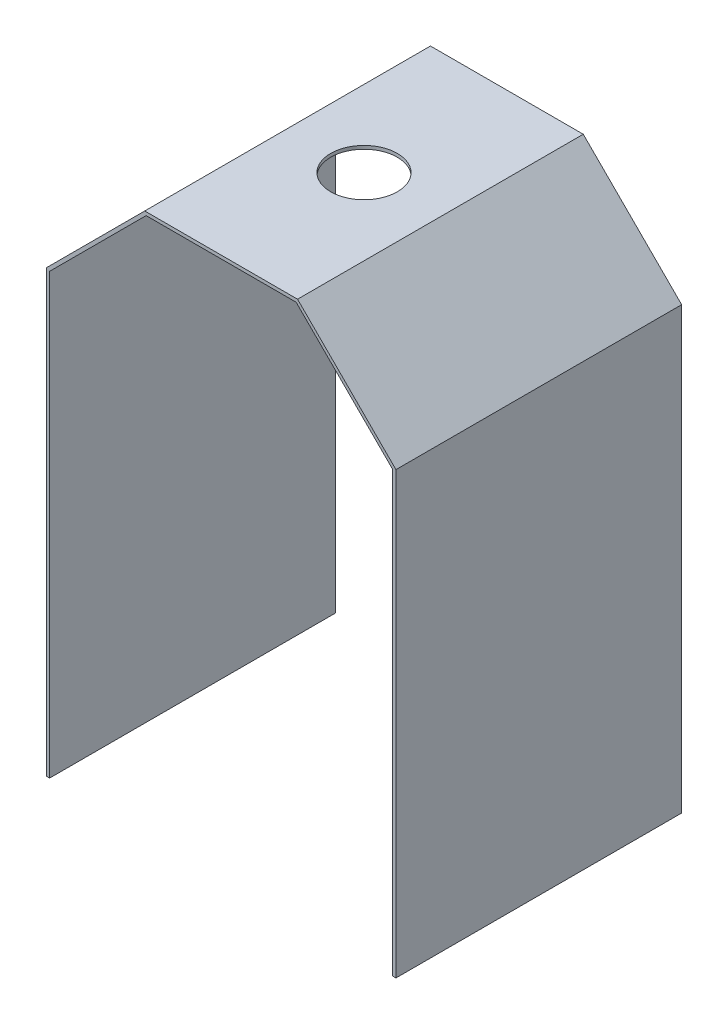
ISO-10303-21;
HEADER;
FILE_DESCRIPTION(('STEP AP214'),'2;1');
FILE_NAME('part.step','',(''),(''),'','','');
FILE_SCHEMA(('AUTOMOTIVE_DESIGN { 1 0 10303 214 1 1 1 1 }'));
ENDSEC;
DATA;
#1=APPLICATION_CONTEXT('core data for automotive mechanical design processes');
#2=APPLICATION_PROTOCOL_DEFINITION('international standard','automotive_design',2000,#1);
#3=PRODUCT_CONTEXT('',#1,'mechanical');
#4=PRODUCT('Part','Part','',(#3));
#5=PRODUCT_RELATED_PRODUCT_CATEGORY('part','',(#4));
#6=PRODUCT_DEFINITION_FORMATION('','',#4);
#7=PRODUCT_DEFINITION_CONTEXT('part definition',#1,'design');
#8=PRODUCT_DEFINITION('design','',#6,#7);
#9=PRODUCT_DEFINITION_SHAPE('','',#8);
#10=(LENGTH_UNIT() NAMED_UNIT(*) SI_UNIT(.MILLI.,.METRE.));
#11=(NAMED_UNIT(*) PLANE_ANGLE_UNIT() SI_UNIT($,.RADIAN.));
#12=(NAMED_UNIT(*) SI_UNIT($,.STERADIAN.) SOLID_ANGLE_UNIT());
#13=UNCERTAINTY_MEASURE_WITH_UNIT(LENGTH_MEASURE(1.E-05),#10,'distance_accuracy_value','');
#14=(GEOMETRIC_REPRESENTATION_CONTEXT(3) GLOBAL_UNCERTAINTY_ASSIGNED_CONTEXT((#13)) GLOBAL_UNIT_ASSIGNED_CONTEXT((#10,
#11,#12)) REPRESENTATION_CONTEXT('',''));
#15=CARTESIAN_POINT('',(0.,0.,0.));
#16=DIRECTION('',(0.,0.,1.));
#17=DIRECTION('',(1.,0.,0.));
#18=AXIS2_PLACEMENT_3D('',#15,#16,#17);
#19=CARTESIAN_POINT('',(111.274765367419,579.392618769199,171.62));
#20=DIRECTION('',(1.,-1.47352495958527E-08,0.));
#21=DIRECTION('',(1.47352495958527E-08,1.,0.));
#22=AXIS2_PLACEMENT_3D('',#19,#20,#21);
#23=PLANE('',#22);
#24=DIRECTION('',(-1.47352495958527E-08,-1.,0.));
#25=VECTOR('',#24,1.);
#26=CARTESIAN_POINT('',(111.274765367419,579.392618769199,0.));
#27=LINE('',#26,#25);
#28=CARTESIAN_POINT('',(111.274765355212,578.56419162719,0.));
#29=VERTEX_POINT('',#28);
#30=CARTESIAN_POINT('',(111.274761470444,314.926454701874,0.));
#31=VERTEX_POINT('',#30);
#32=EDGE_CURVE('E153',#29,#31,#27,.T.);
#33=ORIENTED_EDGE('',*,*,#32,.T.);
#34=DIRECTION('',(0.,0.,-1.));
#35=VECTOR('',#34,1.);
#36=CARTESIAN_POINT('',(111.274761470444,314.926454701874,171.62));
#37=LINE('',#36,#35);
#38=CARTESIAN_POINT('',(111.274761470444,314.926454701874,171.62));
#39=VERTEX_POINT('',#38);
#40=EDGE_CURVE('E11',#39,#31,#37,.T.);
#41=ORIENTED_EDGE('',*,*,#40,.F.);
#42=DIRECTION('',(-1.47352495958527E-08,-1.,0.));
#43=VECTOR('',#42,1.);
#44=CARTESIAN_POINT('',(111.274765367419,579.392618769199,171.62));
#45=LINE('',#44,#43);
#46=CARTESIAN_POINT('',(111.274765355212,578.56419162719,171.62));
#47=VERTEX_POINT('',#46);
#48=EDGE_CURVE('E101',#47,#39,#45,.T.);
#49=ORIENTED_EDGE('',*,*,#48,.F.);
#50=DIRECTION('',(0.,0.,-1.));
#51=VECTOR('',#50,1.);
#52=CARTESIAN_POINT('',(111.274765355212,578.56419162719,171.62));
#53=LINE('',#52,#51);
#54=EDGE_CURVE('E149',#47,#29,#53,.T.);
#55=ORIENTED_EDGE('',*,*,#54,.T.);
#56=EDGE_LOOP('',(#33,#41,#49,#55));
#57=FACE_BOUND('',#56,.T.);
#58=ADVANCED_FACE('F32',(#57),#23,.F.);
#59=CARTESIAN_POINT('',(113.274761470444,314.926454672404,171.62));
#60=DIRECTION('',(-1.47352408053081E-08,-1.,0.));
#61=DIRECTION('',(1.,-1.47352408053081E-08,0.));
#62=AXIS2_PLACEMENT_3D('',#59,#60,#61);
#63=PLANE('',#62);
#64=DIRECTION('',(-1.,1.47352408053081E-08,0.));
#65=VECTOR('',#64,1.);
#66=CARTESIAN_POINT('',(113.274761470444,314.926454672404,0.));
#67=LINE('',#66,#65);
#68=CARTESIAN_POINT('',(113.274761470444,314.926454672404,0.));
#69=VERTEX_POINT('',#68);
#70=EDGE_CURVE('E156',#69,#31,#67,.T.);
#71=ORIENTED_EDGE('',*,*,#70,.F.);
#72=DIRECTION('',(0.,0.,-1.));
#73=VECTOR('',#72,1.);
#74=CARTESIAN_POINT('',(113.274761470444,314.926454672404,171.62));
#75=LINE('',#74,#73);
#76=CARTESIAN_POINT('',(113.274761470444,314.926454672404,171.62));
#77=VERTEX_POINT('',#76);
#78=EDGE_CURVE('E41',#77,#69,#75,.T.);
#79=ORIENTED_EDGE('',*,*,#78,.F.);
#80=DIRECTION('',(-1.,1.47352408053081E-08,0.));
#81=VECTOR('',#80,1.);
#82=CARTESIAN_POINT('',(113.274761470444,314.926454672404,171.62));
#83=LINE('',#82,#81);
#84=EDGE_CURVE('E219',#77,#39,#83,.T.);
#85=ORIENTED_EDGE('',*,*,#84,.T.);
#86=ORIENTED_EDGE('',*,*,#40,.T.);
#87=EDGE_LOOP('',(#71,#79,#85,#86));
#88=FACE_BOUND('',#87,.T.);
#89=ADVANCED_FACE('F206',(#88),#63,.T.);
#90=CARTESIAN_POINT('',(113.274765367419,579.392618739729,171.62));
#91=DIRECTION('',(1.,-1.47352495958527E-08,0.));
#92=DIRECTION('',(1.47352495958527E-08,1.,0.));
#93=AXIS2_PLACEMENT_3D('',#90,#91,#92);
#94=PLANE('',#93);
#95=DIRECTION('',(-1.47352495958527E-08,-1.,0.));
#96=VECTOR('',#95,1.);
#97=CARTESIAN_POINT('',(113.274765367419,579.392618739729,0.));
#98=LINE('',#97,#96);
#99=CARTESIAN_POINT('',(113.274765367419,579.392618739729,0.));
#100=VERTEX_POINT('',#99);
#101=EDGE_CURVE('E159',#100,#69,#98,.T.);
#102=ORIENTED_EDGE('',*,*,#101,.F.);
#103=DIRECTION('',(0.,0.,-1.));
#104=VECTOR('',#103,1.);
#105=CARTESIAN_POINT('',(113.274765367419,579.392618739729,171.62));
#106=LINE('',#105,#104);
#107=CARTESIAN_POINT('',(113.274765367419,579.392618739729,171.62));
#108=VERTEX_POINT('',#107);
#109=EDGE_CURVE('E195',#108,#100,#106,.T.);
#110=ORIENTED_EDGE('',*,*,#109,.F.);
#111=DIRECTION('',(-1.47352495958527E-08,-1.,0.));
#112=VECTOR('',#111,1.);
#113=CARTESIAN_POINT('',(113.274765367419,579.392618739729,171.62));
#114=LINE('',#113,#112);
#115=EDGE_CURVE('E203',#108,#77,#114,.T.);
#116=ORIENTED_EDGE('',*,*,#115,.T.);
#117=ORIENTED_EDGE('',*,*,#78,.T.);
#118=EDGE_LOOP('',(#102,#110,#116,#117));
#119=FACE_BOUND('',#118,.T.);
#120=ADVANCED_FACE('F201',(#119),#94,.T.);
#121=CARTESIAN_POINT('',(54.1708868349344,638.496497272214,171.62));
#122=DIRECTION('',(0.707106781186548,0.707106781186547,0.));
#123=DIRECTION('',(-0.707106781186547,0.707106781186548,0.));
#124=AXIS2_PLACEMENT_3D('',#121,#122,#123);
#125=PLANE('',#124);
#126=DIRECTION('',(0.707106781186547,-0.707106781186548,0.));
#127=VECTOR('',#126,1.);
#128=CARTESIAN_POINT('',(54.1708868349344,638.496497272214,0.));
#129=LINE('',#128,#127);
#130=CARTESIAN_POINT('',(54.1708868349344,638.496497272214,0.));
#131=VERTEX_POINT('',#130);
#132=EDGE_CURVE('E162',#131,#100,#129,.T.);
#133=ORIENTED_EDGE('',*,*,#132,.F.);
#134=DIRECTION('',(0.,0.,-1.));
#135=VECTOR('',#134,1.);
#136=CARTESIAN_POINT('',(54.1708868349344,638.496497272214,171.62));
#137=LINE('',#136,#135);
#138=CARTESIAN_POINT('',(54.1708868349344,638.496497272214,171.62));
#139=VERTEX_POINT('',#138);
#140=EDGE_CURVE('E193',#139,#131,#137,.T.);
#141=ORIENTED_EDGE('',*,*,#140,.F.);
#142=DIRECTION('',(0.707106781186547,-0.707106781186548,0.));
#143=VECTOR('',#142,1.);
#144=CARTESIAN_POINT('',(54.1708868349344,638.496497272214,171.62));
#145=LINE('',#144,#143);
#146=EDGE_CURVE('E216',#139,#108,#145,.T.);
#147=ORIENTED_EDGE('',*,*,#146,.T.);
#148=ORIENTED_EDGE('',*,*,#109,.T.);
#149=EDGE_LOOP('',(#133,#141,#147,#148));
#150=FACE_BOUND('',#149,.T.);
#151=ADVANCED_FACE('F213',(#150),#125,.T.);
#152=CARTESIAN_POINT('',(-37.621355544862,638.496497272214,171.62));
#153=DIRECTION('',(0.,1.,0.));
#154=DIRECTION('',(0.,0.,1.));
#155=AXIS2_PLACEMENT_3D('',#152,#153,#154);
#156=PLANE('',#155);
#157=CARTESIAN_POINT('',(8.27476564503624,638.496497272214,85.81));
#158=DIRECTION('',(0.,1.,0.));
#159=DIRECTION('',(0.,0.,1.));
#160=AXIS2_PLACEMENT_3D('',#157,#158,#159);
#161=CIRCLE('',#160,20.);
#162=CARTESIAN_POINT('',(8.27476564503624,638.496497272214,105.81));
#163=VERTEX_POINT('',#162);
#164=EDGE_CURVE('E281',#163,#163,#161,.T.);
#165=ORIENTED_EDGE('',*,*,#164,.F.);
#166=EDGE_LOOP('',(#165));
#167=FACE_BOUND('',#166,.T.);
#168=DIRECTION('',(1.,0.,0.));
#169=VECTOR('',#168,1.);
#170=CARTESIAN_POINT('',(-37.621355544862,638.496497272214,0.));
#171=LINE('',#170,#169);
#172=CARTESIAN_POINT('',(-37.621355544862,638.496497272214,0.));
#173=VERTEX_POINT('',#172);
#174=EDGE_CURVE('E165',#173,#131,#171,.T.);
#175=ORIENTED_EDGE('',*,*,#174,.F.);
#176=DIRECTION('',(0.,0.,-1.));
#177=VECTOR('',#176,1.);
#178=CARTESIAN_POINT('',(-37.621355544862,638.496497272214,171.62));
#179=LINE('',#178,#177);
#180=CARTESIAN_POINT('',(-37.621355544862,638.496497272214,171.62));
#181=VERTEX_POINT('',#180);
#182=EDGE_CURVE('E191',#181,#173,#179,.T.);
#183=ORIENTED_EDGE('',*,*,#182,.F.);
#184=DIRECTION('',(1.,0.,0.));
#185=VECTOR('',#184,1.);
#186=CARTESIAN_POINT('',(-37.621355544862,638.496497272214,171.62));
#187=LINE('',#186,#185);
#188=EDGE_CURVE('E221',#181,#139,#187,.T.);
#189=ORIENTED_EDGE('',*,*,#188,.T.);
#190=ORIENTED_EDGE('',*,*,#140,.T.);
#191=EDGE_LOOP('',(#175,#183,#189,#190));
#192=FACE_BOUND('',#191,.T.);
#193=ADVANCED_FACE('F286',(#167,#192),#156,.T.);
#194=CARTESIAN_POINT('',(-96.7252349101976,579.392619017346,171.62));
#195=DIRECTION('',(-0.707106774543843,0.707106787829252,0.));
#196=DIRECTION('',(-0.707106787829252,-0.707106774543843,0.));
#197=AXIS2_PLACEMENT_3D('',#194,#195,#196);
#198=PLANE('',#197);
#199=DIRECTION('',(0.707106787829252,0.707106774543843,0.));
#200=VECTOR('',#199,1.);
#201=CARTESIAN_POINT('',(-96.7252349101976,579.392619017346,0.));
#202=LINE('',#201,#200);
#203=CARTESIAN_POINT('',(-96.7252349101976,579.392619017346,0.));
#204=VERTEX_POINT('',#203);
#205=EDGE_CURVE('E168',#204,#173,#202,.T.);
#206=ORIENTED_EDGE('',*,*,#205,.F.);
#207=DIRECTION('',(0.,0.,-1.));
#208=VECTOR('',#207,1.);
#209=CARTESIAN_POINT('',(-96.7252349101976,579.392619017346,171.62));
#210=LINE('',#209,#208);
#211=CARTESIAN_POINT('',(-96.7252349101976,579.392619017346,171.62));
#212=VERTEX_POINT('',#211);
#213=EDGE_CURVE('E189',#212,#204,#210,.T.);
#214=ORIENTED_EDGE('',*,*,#213,.F.);
#215=DIRECTION('',(0.707106787829252,0.707106774543843,0.));
#216=VECTOR('',#215,1.);
#217=CARTESIAN_POINT('',(-96.7252349101976,579.392619017346,171.62));
#218=LINE('',#217,#216);
#219=EDGE_CURVE('E227',#212,#181,#218,.T.);
#220=ORIENTED_EDGE('',*,*,#219,.T.);
#221=ORIENTED_EDGE('',*,*,#182,.T.);
#222=EDGE_LOOP('',(#206,#214,#220,#221));
#223=FACE_BOUND('',#222,.T.);
#224=ADVANCED_FACE('F289',(#223),#198,.T.);
#225=CARTESIAN_POINT('',(-96.7252349101976,314.926453532472,171.62));
#226=DIRECTION('',(-1.,0.,0.));
#227=DIRECTION('',(0.,0.,1.));
#228=AXIS2_PLACEMENT_3D('',#225,#226,#227);
#229=PLANE('',#228);
#230=DIRECTION('',(0.,1.,0.));
#231=VECTOR('',#230,1.);
#232=CARTESIAN_POINT('',(-96.7252349101976,314.926453532472,0.));
#233=LINE('',#232,#231);
#234=CARTESIAN_POINT('',(-96.7252349101976,314.926453532472,0.));
#235=VERTEX_POINT('',#234);
#236=EDGE_CURVE('E171',#235,#204,#233,.T.);
#237=ORIENTED_EDGE('',*,*,#236,.F.);
#238=DIRECTION('',(0.,0.,-1.));
#239=VECTOR('',#238,1.);
#240=CARTESIAN_POINT('',(-96.7252349101976,314.926453532472,171.62));
#241=LINE('',#240,#239);
#242=CARTESIAN_POINT('',(-96.7252349101976,314.926453532472,171.62));
#243=VERTEX_POINT('',#242);
#244=EDGE_CURVE('E187',#243,#235,#241,.T.);
#245=ORIENTED_EDGE('',*,*,#244,.F.);
#246=DIRECTION('',(0.,1.,0.));
#247=VECTOR('',#246,1.);
#248=CARTESIAN_POINT('',(-96.7252349101976,314.926453532472,171.62));
#249=LINE('',#248,#247);
#250=EDGE_CURVE('E230',#243,#212,#249,.T.);
#251=ORIENTED_EDGE('',*,*,#250,.T.);
#252=ORIENTED_EDGE('',*,*,#213,.T.);
#253=EDGE_LOOP('',(#237,#245,#251,#252));
#254=FACE_BOUND('',#253,.T.);
#255=ADVANCED_FACE('F242',(#254),#229,.T.);
#256=CARTESIAN_POINT('',(-94.7252349101976,314.926453532472,171.62));
#257=DIRECTION('',(0.,-1.,0.));
#258=DIRECTION('',(0.,0.,-1.));
#259=AXIS2_PLACEMENT_3D('',#256,#257,#258);
#260=PLANE('',#259);
#261=DIRECTION('',(-1.,0.,0.));
#262=VECTOR('',#261,1.);
#263=CARTESIAN_POINT('',(-94.7252349101976,314.926453532472,0.));
#264=LINE('',#263,#262);
#265=CARTESIAN_POINT('',(-94.7252349101976,314.926453532472,0.));
#266=VERTEX_POINT('',#265);
#267=EDGE_CURVE('E174',#266,#235,#264,.T.);
#268=ORIENTED_EDGE('',*,*,#267,.F.);
#269=DIRECTION('',(0.,0.,-1.));
#270=VECTOR('',#269,1.);
#271=CARTESIAN_POINT('',(-94.7252349101976,314.926453532472,171.62));
#272=LINE('',#271,#270);
#273=CARTESIAN_POINT('',(-94.7252349101976,314.926453532472,171.62));
#274=VERTEX_POINT('',#273);
#275=EDGE_CURVE('E185',#274,#266,#272,.T.);
#276=ORIENTED_EDGE('',*,*,#275,.F.);
#277=DIRECTION('',(-1.,0.,0.));
#278=VECTOR('',#277,1.);
#279=CARTESIAN_POINT('',(-94.7252349101976,314.926453532472,171.62));
#280=LINE('',#279,#278);
#281=EDGE_CURVE('E233',#274,#243,#280,.T.);
#282=ORIENTED_EDGE('',*,*,#281,.T.);
#283=ORIENTED_EDGE('',*,*,#244,.T.);
#284=EDGE_LOOP('',(#268,#276,#282,#283));
#285=FACE_BOUND('',#284,.T.);
#286=ADVANCED_FACE('F237',(#285),#260,.T.);
#287=CARTESIAN_POINT('',(-94.7252349101976,314.926453532472,171.62));
#288=DIRECTION('',(-1.,0.,0.));
#289=DIRECTION('',(0.,0.,1.));
#290=AXIS2_PLACEMENT_3D('',#287,#288,#289);
#291=PLANE('',#290);
#292=DIRECTION('',(0.,1.,0.));
#293=VECTOR('',#292,1.);
#294=CARTESIAN_POINT('',(-94.7252349101976,314.926453532472,0.));
#295=LINE('',#294,#293);
#296=CARTESIAN_POINT('',(-94.7252349101976,578.564191881594,0.));
#297=VERTEX_POINT('',#296);
#298=EDGE_CURVE('E177',#266,#297,#295,.T.);
#299=ORIENTED_EDGE('',*,*,#298,.T.);
#300=DIRECTION('',(0.,0.,-1.));
#301=VECTOR('',#300,1.);
#302=CARTESIAN_POINT('',(-94.7252349101976,578.564191881594,171.62));
#303=LINE('',#302,#301);
#304=CARTESIAN_POINT('',(-94.7252349101976,578.564191881594,171.62));
#305=VERTEX_POINT('',#304);
#306=EDGE_CURVE('E144',#305,#297,#303,.T.);
#307=ORIENTED_EDGE('',*,*,#306,.F.);
#308=DIRECTION('',(0.,1.,0.));
#309=VECTOR('',#308,1.);
#310=CARTESIAN_POINT('',(-94.7252349101976,314.926453532472,171.62));
#311=LINE('',#310,#309);
#312=EDGE_CURVE('E135',#274,#305,#311,.T.);
#313=ORIENTED_EDGE('',*,*,#312,.F.);
#314=ORIENTED_EDGE('',*,*,#275,.T.);
#315=EDGE_LOOP('',(#299,#307,#313,#314));
#316=FACE_BOUND('',#315,.T.);
#317=ADVANCED_FACE('F246',(#316),#291,.F.);
#318=CARTESIAN_POINT('',(-95.31102136111,577.978405441687,171.62));
#319=DIRECTION('',(-0.707106774543843,0.707106787829252,0.));
#320=DIRECTION('',(-0.707106787829252,-0.707106774543843,0.));
#321=AXIS2_PLACEMENT_3D('',#318,#319,#320);
#322=PLANE('',#321);
#323=DIRECTION('',(0.707106787829252,0.707106774543843,0.));
#324=VECTOR('',#323,1.);
#325=CARTESIAN_POINT('',(-95.31102136111,577.978405441687,0.));
#326=LINE('',#325,#324);
#327=CARTESIAN_POINT('',(-36.7929284311218,636.496497272214,0.));
#328=VERTEX_POINT('',#327);
#329=EDGE_CURVE('E143',#297,#328,#326,.T.);
#330=ORIENTED_EDGE('',*,*,#329,.T.);
#331=DIRECTION('',(0.,0.,-1.));
#332=VECTOR('',#331,1.);
#333=CARTESIAN_POINT('',(-36.7929284311218,636.496497272214,171.62));
#334=LINE('',#333,#332);
#335=CARTESIAN_POINT('',(-36.7929284311218,636.496497272214,171.62));
#336=VERTEX_POINT('',#335);
#337=EDGE_CURVE('E140',#336,#328,#334,.T.);
#338=ORIENTED_EDGE('',*,*,#337,.F.);
#339=DIRECTION('',(0.707106787829252,0.707106774543843,0.));
#340=VECTOR('',#339,1.);
#341=CARTESIAN_POINT('',(-95.31102136111,577.978405441687,171.62));
#342=LINE('',#341,#340);
#343=EDGE_CURVE('E128',#305,#336,#342,.T.);
#344=ORIENTED_EDGE('',*,*,#343,.F.);
#345=ORIENTED_EDGE('',*,*,#306,.T.);
#346=EDGE_LOOP('',(#330,#338,#344,#345));
#347=FACE_BOUND('',#346,.T.);
#348=ADVANCED_FACE('F141',(#347),#322,.F.);
#349=CARTESIAN_POINT('',(-37.621355544862,636.496497272214,171.62));
#350=DIRECTION('',(0.,1.,0.));
#351=DIRECTION('',(0.,0.,1.));
#352=AXIS2_PLACEMENT_3D('',#349,#350,#351);
#353=PLANE('',#352);
#354=CARTESIAN_POINT('',(8.27476564503624,636.496497272214,85.81));
#355=DIRECTION('',(0.,1.,0.));
#356=DIRECTION('',(0.,0.,1.));
#357=AXIS2_PLACEMENT_3D('',#354,#355,#356);
#358=CIRCLE('',#357,20.);
#359=CARTESIAN_POINT('',(8.27476564503624,636.496497272214,105.81));
#360=VERTEX_POINT('',#359);
#361=EDGE_CURVE('E35',#360,#360,#358,.T.);
#362=ORIENTED_EDGE('',*,*,#361,.T.);
#363=EDGE_LOOP('',(#362));
#364=FACE_BOUND('',#363,.T.);
#365=DIRECTION('',(1.,0.,0.));
#366=VECTOR('',#365,1.);
#367=CARTESIAN_POINT('',(-37.621355544862,636.496497272214,0.));
#368=LINE('',#367,#366);
#369=CARTESIAN_POINT('',(53.3424597101882,636.496497272214,0.));
#370=VERTEX_POINT('',#369);
#371=EDGE_CURVE('E89',#328,#370,#368,.T.);
#372=ORIENTED_EDGE('',*,*,#371,.T.);
#373=DIRECTION('',(0.,0.,-1.));
#374=VECTOR('',#373,1.);
#375=CARTESIAN_POINT('',(53.3424597101882,636.496497272214,171.62));
#376=LINE('',#375,#374);
#377=CARTESIAN_POINT('',(53.3424597101882,636.496497272214,171.62));
#378=VERTEX_POINT('',#377);
#379=EDGE_CURVE('E145',#378,#370,#376,.T.);
#380=ORIENTED_EDGE('',*,*,#379,.F.);
#381=DIRECTION('',(1.,0.,0.));
#382=VECTOR('',#381,1.);
#383=CARTESIAN_POINT('',(-37.621355544862,636.496497272214,171.62));
#384=LINE('',#383,#382);
#385=EDGE_CURVE('E132',#336,#378,#384,.T.);
#386=ORIENTED_EDGE('',*,*,#385,.F.);
#387=ORIENTED_EDGE('',*,*,#337,.T.);
#388=EDGE_LOOP('',(#372,#380,#386,#387));
#389=FACE_BOUND('',#388,.T.);
#390=ADVANCED_FACE('F147',(#364,#389),#353,.F.);
#391=CARTESIAN_POINT('',(52.7566732725613,637.08228370984,171.62));
#392=DIRECTION('',(0.707106781186548,0.707106781186547,0.));
#393=DIRECTION('',(-0.707106781186547,0.707106781186548,0.));
#394=AXIS2_PLACEMENT_3D('',#391,#392,#393);
#395=PLANE('',#394);
#396=DIRECTION('',(0.707106781186547,-0.707106781186548,0.));
#397=VECTOR('',#396,1.);
#398=CARTESIAN_POINT('',(52.7566732725613,637.08228370984,0.));
#399=LINE('',#398,#397);
#400=EDGE_CURVE('E95',#370,#29,#399,.T.);
#401=ORIENTED_EDGE('',*,*,#400,.T.);
#402=ORIENTED_EDGE('',*,*,#54,.F.);
#403=DIRECTION('',(0.707106781186547,-0.707106781186548,0.));
#404=VECTOR('',#403,1.);
#405=CARTESIAN_POINT('',(52.7566732725613,637.08228370984,171.62));
#406=LINE('',#405,#404);
#407=EDGE_CURVE('E49',#378,#47,#406,.T.);
#408=ORIENTED_EDGE('',*,*,#407,.F.);
#409=ORIENTED_EDGE('',*,*,#379,.T.);
#410=EDGE_LOOP('',(#401,#402,#408,#409));
#411=FACE_BOUND('',#410,.T.);
#412=ADVANCED_FACE('F260',(#411),#395,.F.);
#413=CARTESIAN_POINT('',(111.274761470444,314.926454701874,171.62));
#414=DIRECTION('',(0.,0.,-1.));
#415=DIRECTION('',(-1.,0.,0.));
#416=AXIS2_PLACEMENT_3D('',#413,#414,#415);
#417=PLANE('',#416);
#418=ORIENTED_EDGE('',*,*,#48,.T.);
#419=ORIENTED_EDGE('',*,*,#84,.F.);
#420=ORIENTED_EDGE('',*,*,#115,.F.);
#421=ORIENTED_EDGE('',*,*,#146,.F.);
#422=ORIENTED_EDGE('',*,*,#188,.F.);
#423=ORIENTED_EDGE('',*,*,#219,.F.);
#424=ORIENTED_EDGE('',*,*,#250,.F.);
#425=ORIENTED_EDGE('',*,*,#281,.F.);
#426=ORIENTED_EDGE('',*,*,#312,.T.);
#427=ORIENTED_EDGE('',*,*,#343,.T.);
#428=ORIENTED_EDGE('',*,*,#385,.T.);
#429=ORIENTED_EDGE('',*,*,#407,.T.);
#430=EDGE_LOOP('',(#418,#419,#420,#421,#422,#423,#424,#425,#426,#427,#428,#429));
#431=FACE_BOUND('',#430,.T.);
#432=ADVANCED_FACE('F130',(#431),#417,.F.);
#433=CARTESIAN_POINT('',(111.274761470444,314.926454701874,0.));
#434=DIRECTION('',(0.,0.,-1.));
#435=DIRECTION('',(-1.,0.,0.));
#436=AXIS2_PLACEMENT_3D('',#433,#434,#435);
#437=PLANE('',#436);
#438=ORIENTED_EDGE('',*,*,#32,.F.);
#439=ORIENTED_EDGE('',*,*,#400,.F.);
#440=ORIENTED_EDGE('',*,*,#371,.F.);
#441=ORIENTED_EDGE('',*,*,#329,.F.);
#442=ORIENTED_EDGE('',*,*,#298,.F.);
#443=ORIENTED_EDGE('',*,*,#267,.T.);
#444=ORIENTED_EDGE('',*,*,#236,.T.);
#445=ORIENTED_EDGE('',*,*,#205,.T.);
#446=ORIENTED_EDGE('',*,*,#174,.T.);
#447=ORIENTED_EDGE('',*,*,#132,.T.);
#448=ORIENTED_EDGE('',*,*,#101,.T.);
#449=ORIENTED_EDGE('',*,*,#70,.T.);
#450=EDGE_LOOP('',(#438,#439,#440,#441,#442,#443,#444,#445,#446,#447,#448,#449));
#451=FACE_BOUND('',#450,.T.);
#452=ADVANCED_FACE('F209',(#451),#437,.T.);
#453=CARTESIAN_POINT('',(8.27476564503624,314.926453532472,85.81));
#454=DIRECTION('',(0.,1.,0.));
#455=DIRECTION('',(0.,0.,1.));
#456=AXIS2_PLACEMENT_3D('',#453,#454,#455);
#457=CYLINDRICAL_SURFACE('',#456,20.);
#458=ORIENTED_EDGE('',*,*,#164,.T.);
#459=EDGE_LOOP('',(#458));
#460=FACE_BOUND('',#459,.T.);
#461=ORIENTED_EDGE('',*,*,#361,.F.);
#462=EDGE_LOOP('',(#461));
#463=FACE_BOUND('',#462,.T.);
#464=ADVANCED_FACE('F272',(#460,#463),#457,.F.);
#465=CLOSED_SHELL('',(#58,#89,#120,#151,#193,#224,#255,#286,#317,#348,#390,#412,#432,#452,#464));
#466=MANIFOLD_SOLID_BREP('B2',#465);
#467=ADVANCED_BREP_SHAPE_REPRESENTATION('',(#18,#466),#14);
#468=SHAPE_DEFINITION_REPRESENTATION(#9,#467);
ENDSEC;
END-ISO-10303-21;
